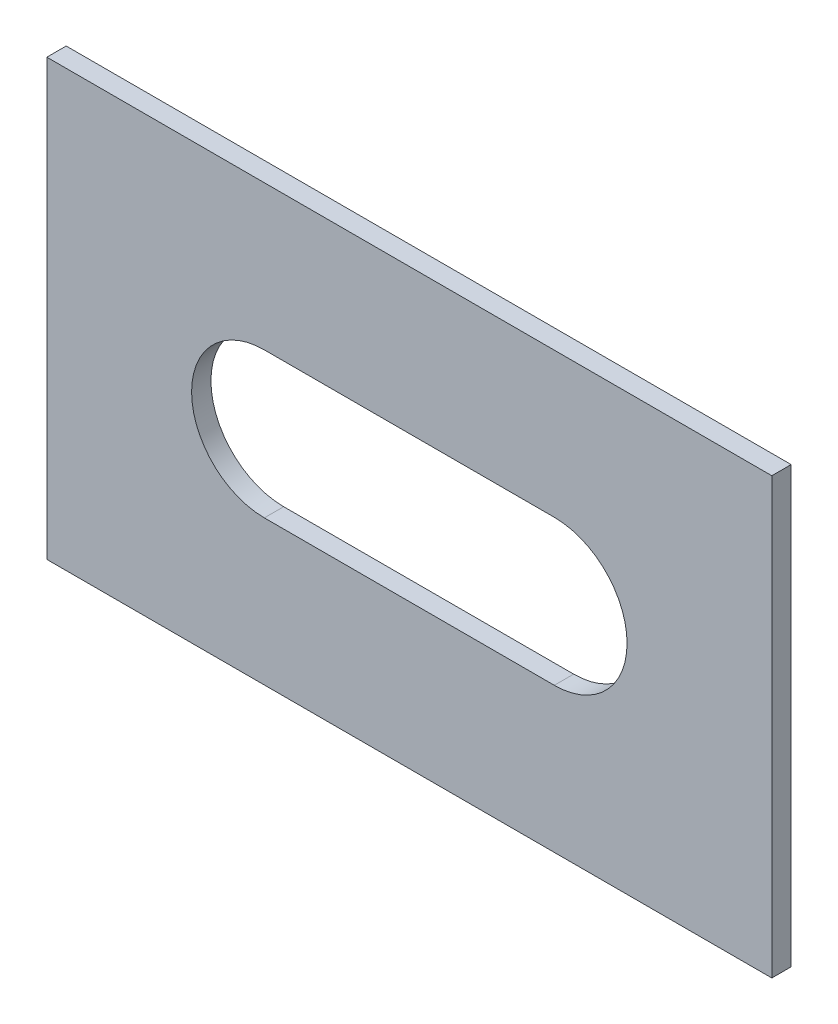
ISO-10303-21;
HEADER;
FILE_DESCRIPTION(('STEP AP214'),'2;1');
FILE_NAME('part.step','',(''),(''),'','','');
FILE_SCHEMA(('AUTOMOTIVE_DESIGN { 1 0 10303 214 1 1 1 1 }'));
ENDSEC;
DATA;
#1=APPLICATION_CONTEXT('core data for automotive mechanical design processes');
#2=APPLICATION_PROTOCOL_DEFINITION('international standard','automotive_design',2000,#1);
#3=PRODUCT_CONTEXT('',#1,'mechanical');
#4=PRODUCT('Part','Part','',(#3));
#5=PRODUCT_RELATED_PRODUCT_CATEGORY('part','',(#4));
#6=PRODUCT_DEFINITION_FORMATION('','',#4);
#7=PRODUCT_DEFINITION_CONTEXT('part definition',#1,'design');
#8=PRODUCT_DEFINITION('design','',#6,#7);
#9=PRODUCT_DEFINITION_SHAPE('','',#8);
#10=(LENGTH_UNIT() NAMED_UNIT(*) SI_UNIT(.MILLI.,.METRE.));
#11=(NAMED_UNIT(*) PLANE_ANGLE_UNIT() SI_UNIT($,.RADIAN.));
#12=(NAMED_UNIT(*) SI_UNIT($,.STERADIAN.) SOLID_ANGLE_UNIT());
#13=UNCERTAINTY_MEASURE_WITH_UNIT(LENGTH_MEASURE(1.E-05),#10,'distance_accuracy_value','');
#14=(GEOMETRIC_REPRESENTATION_CONTEXT(3) GLOBAL_UNCERTAINTY_ASSIGNED_CONTEXT((#13)) GLOBAL_UNIT_ASSIGNED_CONTEXT((#10,
#11,#12)) REPRESENTATION_CONTEXT('',''));
#15=CARTESIAN_POINT('',(0.,0.,0.));
#16=DIRECTION('',(0.,0.,1.));
#17=DIRECTION('',(1.,0.,0.));
#18=AXIS2_PLACEMENT_3D('',#15,#16,#17);
#19=CARTESIAN_POINT('',(0.,0.,4.));
#20=DIRECTION('',(0.,0.,-1.));
#21=DIRECTION('',(-1.,0.,0.));
#22=AXIS2_PLACEMENT_3D('',#19,#20,#21);
#23=PLANE('',#22);
#24=DIRECTION('',(0.,-1.,0.));
#25=VECTOR('',#24,1.);
#26=CARTESIAN_POINT('',(0.,0.,4.));
#27=LINE('',#26,#25);
#28=CARTESIAN_POINT('',(0.,90.,4.));
#29=VERTEX_POINT('',#28);
#30=CARTESIAN_POINT('',(0.,0.,4.));
#31=VERTEX_POINT('',#30);
#32=EDGE_CURVE('E146',#29,#31,#27,.T.);
#33=ORIENTED_EDGE('',*,*,#32,.T.);
#34=DIRECTION('',(1.,0.,0.));
#35=VECTOR('',#34,1.);
#36=CARTESIAN_POINT('',(0.,0.,4.));
#37=LINE('',#36,#35);
#38=CARTESIAN_POINT('',(150.,0.,4.));
#39=VERTEX_POINT('',#38);
#40=EDGE_CURVE('E149',#31,#39,#37,.T.);
#41=ORIENTED_EDGE('',*,*,#40,.T.);
#42=DIRECTION('',(0.,1.,0.));
#43=VECTOR('',#42,1.);
#44=CARTESIAN_POINT('',(150.,0.,4.));
#45=LINE('',#44,#43);
#46=CARTESIAN_POINT('',(150.,90.,4.));
#47=VERTEX_POINT('',#46);
#48=EDGE_CURVE('E152',#39,#47,#45,.T.);
#49=ORIENTED_EDGE('',*,*,#48,.T.);
#50=DIRECTION('',(-1.,0.,0.));
#51=VECTOR('',#50,1.);
#52=CARTESIAN_POINT('',(0.,90.,4.));
#53=LINE('',#52,#51);
#54=EDGE_CURVE('E154',#47,#29,#53,.T.);
#55=ORIENTED_EDGE('',*,*,#54,.T.);
#56=EDGE_LOOP('',(#33,#41,#49,#55));
#57=FACE_BOUND('',#56,.T.);
#58=CARTESIAN_POINT('',(105.,45.,4.));
#59=DIRECTION('',(0.,0.,1.));
#60=DIRECTION('',(1.,0.,0.));
#61=AXIS2_PLACEMENT_3D('',#58,#59,#60);
#62=CIRCLE('',#61,15.05);
#63=CARTESIAN_POINT('',(105.,29.95,4.));
#64=VERTEX_POINT('',#63);
#65=CARTESIAN_POINT('',(105.,60.05,4.));
#66=VERTEX_POINT('',#65);
#67=EDGE_CURVE('E110',#64,#66,#62,.T.);
#68=ORIENTED_EDGE('',*,*,#67,.F.);
#69=DIRECTION('',(1.,0.,0.));
#70=VECTOR('',#69,1.);
#71=CARTESIAN_POINT('',(45.,29.95,4.));
#72=LINE('',#71,#70);
#73=CARTESIAN_POINT('',(45.,29.95,4.));
#74=VERTEX_POINT('',#73);
#75=EDGE_CURVE('E132',#74,#64,#72,.T.);
#76=ORIENTED_EDGE('',*,*,#75,.F.);
#77=CARTESIAN_POINT('',(45.,45.,4.));
#78=DIRECTION('',(0.,0.,1.));
#79=DIRECTION('',(1.,0.,0.));
#80=AXIS2_PLACEMENT_3D('',#77,#78,#79);
#81=CIRCLE('',#80,15.05);
#82=CARTESIAN_POINT('',(45.,60.05,4.));
#83=VERTEX_POINT('',#82);
#84=EDGE_CURVE('E130',#83,#74,#81,.T.);
#85=ORIENTED_EDGE('',*,*,#84,.F.);
#86=DIRECTION('',(-1.,0.,0.));
#87=VECTOR('',#86,1.);
#88=CARTESIAN_POINT('',(45.,60.05,4.));
#89=LINE('',#88,#87);
#90=EDGE_CURVE('E118',#66,#83,#89,.T.);
#91=ORIENTED_EDGE('',*,*,#90,.F.);
#92=EDGE_LOOP('',(#68,#76,#85,#91));
#93=FACE_BOUND('',#92,.T.);
#94=ADVANCED_FACE('F45',(#57,#93),#23,.F.);
#95=CARTESIAN_POINT('',(0.,0.,0.));
#96=DIRECTION('',(0.,0.,-1.));
#97=DIRECTION('',(-1.,0.,0.));
#98=AXIS2_PLACEMENT_3D('',#95,#96,#97);
#99=PLANE('',#98);
#100=DIRECTION('',(0.,-1.,0.));
#101=VECTOR('',#100,1.);
#102=CARTESIAN_POINT('',(0.,0.,0.));
#103=LINE('',#102,#101);
#104=CARTESIAN_POINT('',(0.,90.,0.));
#105=VERTEX_POINT('',#104);
#106=CARTESIAN_POINT('',(0.,0.,0.));
#107=VERTEX_POINT('',#106);
#108=EDGE_CURVE('E126',#105,#107,#103,.T.);
#109=ORIENTED_EDGE('',*,*,#108,.F.);
#110=DIRECTION('',(-1.,0.,0.));
#111=VECTOR('',#110,1.);
#112=CARTESIAN_POINT('',(0.,90.,0.));
#113=LINE('',#112,#111);
#114=CARTESIAN_POINT('',(150.,90.,0.));
#115=VERTEX_POINT('',#114);
#116=EDGE_CURVE('E150',#115,#105,#113,.T.);
#117=ORIENTED_EDGE('',*,*,#116,.F.);
#118=DIRECTION('',(0.,1.,0.));
#119=VECTOR('',#118,1.);
#120=CARTESIAN_POINT('',(150.,0.,0.));
#121=LINE('',#120,#119);
#122=CARTESIAN_POINT('',(150.,0.,0.));
#123=VERTEX_POINT('',#122);
#124=EDGE_CURVE('E161',#123,#115,#121,.T.);
#125=ORIENTED_EDGE('',*,*,#124,.F.);
#126=DIRECTION('',(1.,0.,0.));
#127=VECTOR('',#126,1.);
#128=CARTESIAN_POINT('',(0.,0.,0.));
#129=LINE('',#128,#127);
#130=EDGE_CURVE('E159',#107,#123,#129,.T.);
#131=ORIENTED_EDGE('',*,*,#130,.F.);
#132=EDGE_LOOP('',(#109,#117,#125,#131));
#133=FACE_BOUND('',#132,.T.);
#134=DIRECTION('',(1.,0.,0.));
#135=VECTOR('',#134,1.);
#136=CARTESIAN_POINT('',(45.,29.95,0.));
#137=LINE('',#136,#135);
#138=CARTESIAN_POINT('',(45.,29.95,0.));
#139=VERTEX_POINT('',#138);
#140=CARTESIAN_POINT('',(105.,29.95,0.));
#141=VERTEX_POINT('',#140);
#142=EDGE_CURVE('E119',#139,#141,#137,.T.);
#143=ORIENTED_EDGE('',*,*,#142,.T.);
#144=CARTESIAN_POINT('',(105.,45.,0.));
#145=DIRECTION('',(0.,0.,1.));
#146=DIRECTION('',(1.,0.,0.));
#147=AXIS2_PLACEMENT_3D('',#144,#145,#146);
#148=CIRCLE('',#147,15.05);
#149=CARTESIAN_POINT('',(105.,60.05,0.));
#150=VERTEX_POINT('',#149);
#151=EDGE_CURVE('E68',#141,#150,#148,.T.);
#152=ORIENTED_EDGE('',*,*,#151,.T.);
#153=DIRECTION('',(-1.,0.,0.));
#154=VECTOR('',#153,1.);
#155=CARTESIAN_POINT('',(45.,60.05,0.));
#156=LINE('',#155,#154);
#157=CARTESIAN_POINT('',(45.,60.05,0.));
#158=VERTEX_POINT('',#157);
#159=EDGE_CURVE('E125',#150,#158,#156,.T.);
#160=ORIENTED_EDGE('',*,*,#159,.T.);
#161=CARTESIAN_POINT('',(45.,45.,0.));
#162=DIRECTION('',(0.,0.,1.));
#163=DIRECTION('',(1.,0.,0.));
#164=AXIS2_PLACEMENT_3D('',#161,#162,#163);
#165=CIRCLE('',#164,15.05);
#166=EDGE_CURVE('E138',#158,#139,#165,.T.);
#167=ORIENTED_EDGE('',*,*,#166,.T.);
#168=EDGE_LOOP('',(#143,#152,#160,#167));
#169=FACE_BOUND('',#168,.T.);
#170=ADVANCED_FACE('F179',(#133,#169),#99,.T.);
#171=CARTESIAN_POINT('',(0.,0.,4.));
#172=DIRECTION('',(1.,0.,0.));
#173=DIRECTION('',(0.,0.,-1.));
#174=AXIS2_PLACEMENT_3D('',#171,#172,#173);
#175=PLANE('',#174);
#176=ORIENTED_EDGE('',*,*,#108,.T.);
#177=DIRECTION('',(0.,0.,-1.));
#178=VECTOR('',#177,1.);
#179=CARTESIAN_POINT('',(0.,0.,4.));
#180=LINE('',#179,#178);
#181=EDGE_CURVE('E11',#31,#107,#180,.T.);
#182=ORIENTED_EDGE('',*,*,#181,.F.);
#183=ORIENTED_EDGE('',*,*,#32,.F.);
#184=DIRECTION('',(0.,0.,-1.));
#185=VECTOR('',#184,1.);
#186=CARTESIAN_POINT('',(0.,90.,4.));
#187=LINE('',#186,#185);
#188=EDGE_CURVE('E156',#29,#105,#187,.T.);
#189=ORIENTED_EDGE('',*,*,#188,.T.);
#190=EDGE_LOOP('',(#176,#182,#183,#189));
#191=FACE_BOUND('',#190,.T.);
#192=ADVANCED_FACE('F47',(#191),#175,.F.);
#193=CARTESIAN_POINT('',(0.,0.,4.));
#194=DIRECTION('',(0.,1.,0.));
#195=DIRECTION('',(0.,0.,1.));
#196=AXIS2_PLACEMENT_3D('',#193,#194,#195);
#197=PLANE('',#196);
#198=ORIENTED_EDGE('',*,*,#130,.T.);
#199=DIRECTION('',(0.,0.,-1.));
#200=VECTOR('',#199,1.);
#201=CARTESIAN_POINT('',(150.,0.,4.));
#202=LINE('',#201,#200);
#203=EDGE_CURVE('E53',#39,#123,#202,.T.);
#204=ORIENTED_EDGE('',*,*,#203,.F.);
#205=ORIENTED_EDGE('',*,*,#40,.F.);
#206=ORIENTED_EDGE('',*,*,#181,.T.);
#207=EDGE_LOOP('',(#198,#204,#205,#206));
#208=FACE_BOUND('',#207,.T.);
#209=ADVANCED_FACE('F189',(#208),#197,.F.);
#210=CARTESIAN_POINT('',(150.,0.,4.));
#211=DIRECTION('',(-1.,0.,0.));
#212=DIRECTION('',(0.,0.,1.));
#213=AXIS2_PLACEMENT_3D('',#210,#211,#212);
#214=PLANE('',#213);
#215=ORIENTED_EDGE('',*,*,#124,.T.);
#216=DIRECTION('',(0.,0.,-1.));
#217=VECTOR('',#216,1.);
#218=CARTESIAN_POINT('',(150.,90.,4.));
#219=LINE('',#218,#217);
#220=EDGE_CURVE('E166',#47,#115,#219,.T.);
#221=ORIENTED_EDGE('',*,*,#220,.F.);
#222=ORIENTED_EDGE('',*,*,#48,.F.);
#223=ORIENTED_EDGE('',*,*,#203,.T.);
#224=EDGE_LOOP('',(#215,#221,#222,#223));
#225=FACE_BOUND('',#224,.T.);
#226=ADVANCED_FACE('F173',(#225),#214,.F.);
#227=CARTESIAN_POINT('',(0.,90.,4.));
#228=DIRECTION('',(0.,-1.,0.));
#229=DIRECTION('',(0.,0.,-1.));
#230=AXIS2_PLACEMENT_3D('',#227,#228,#229);
#231=PLANE('',#230);
#232=ORIENTED_EDGE('',*,*,#116,.T.);
#233=ORIENTED_EDGE('',*,*,#188,.F.);
#234=ORIENTED_EDGE('',*,*,#54,.F.);
#235=ORIENTED_EDGE('',*,*,#220,.T.);
#236=EDGE_LOOP('',(#232,#233,#234,#235));
#237=FACE_BOUND('',#236,.T.);
#238=ADVANCED_FACE('F183',(#237),#231,.F.);
#239=CARTESIAN_POINT('',(105.,45.,4.));
#240=DIRECTION('',(0.,0.,-1.));
#241=DIRECTION('',(-1.,0.,0.));
#242=AXIS2_PLACEMENT_3D('',#239,#240,#241);
#243=CYLINDRICAL_SURFACE('',#242,15.05);
#244=ORIENTED_EDGE('',*,*,#151,.F.);
#245=DIRECTION('',(0.,0.,-1.));
#246=VECTOR('',#245,1.);
#247=CARTESIAN_POINT('',(105.,29.95,4.));
#248=LINE('',#247,#246);
#249=EDGE_CURVE('E114',#64,#141,#248,.T.);
#250=ORIENTED_EDGE('',*,*,#249,.F.);
#251=ORIENTED_EDGE('',*,*,#67,.T.);
#252=DIRECTION('',(0.,0.,-1.));
#253=VECTOR('',#252,1.);
#254=CARTESIAN_POINT('',(105.,60.05,4.));
#255=LINE('',#254,#253);
#256=EDGE_CURVE('E113',#66,#150,#255,.T.);
#257=ORIENTED_EDGE('',*,*,#256,.T.);
#258=EDGE_LOOP('',(#244,#250,#251,#257));
#259=FACE_BOUND('',#258,.T.);
#260=ADVANCED_FACE('F112',(#259),#243,.F.);
#261=CARTESIAN_POINT('',(45.,60.05,4.));
#262=DIRECTION('',(0.,-1.,0.));
#263=DIRECTION('',(1.,0.,0.));
#264=AXIS2_PLACEMENT_3D('',#261,#262,#263);
#265=PLANE('',#264);
#266=ORIENTED_EDGE('',*,*,#159,.F.);
#267=ORIENTED_EDGE('',*,*,#256,.F.);
#268=ORIENTED_EDGE('',*,*,#90,.T.);
#269=DIRECTION('',(0.,0.,-1.));
#270=VECTOR('',#269,1.);
#271=CARTESIAN_POINT('',(45.,60.05,4.));
#272=LINE('',#271,#270);
#273=EDGE_CURVE('E127',#83,#158,#272,.T.);
#274=ORIENTED_EDGE('',*,*,#273,.T.);
#275=EDGE_LOOP('',(#266,#267,#268,#274));
#276=FACE_BOUND('',#275,.T.);
#277=ADVANCED_FACE('F122',(#276),#265,.T.);
#278=CARTESIAN_POINT('',(45.,45.,4.));
#279=DIRECTION('',(0.,0.,-1.));
#280=DIRECTION('',(-1.,0.,0.));
#281=AXIS2_PLACEMENT_3D('',#278,#279,#280);
#282=CYLINDRICAL_SURFACE('',#281,15.05);
#283=ORIENTED_EDGE('',*,*,#166,.F.);
#284=ORIENTED_EDGE('',*,*,#273,.F.);
#285=ORIENTED_EDGE('',*,*,#84,.T.);
#286=DIRECTION('',(0.,0.,-1.));
#287=VECTOR('',#286,1.);
#288=CARTESIAN_POINT('',(45.,29.95,4.));
#289=LINE('',#288,#287);
#290=EDGE_CURVE('E60',#74,#139,#289,.T.);
#291=ORIENTED_EDGE('',*,*,#290,.T.);
#292=EDGE_LOOP('',(#283,#284,#285,#291));
#293=FACE_BOUND('',#292,.T.);
#294=ADVANCED_FACE('F212',(#293),#282,.F.);
#295=CARTESIAN_POINT('',(45.,29.95,4.));
#296=DIRECTION('',(0.,1.,0.));
#297=DIRECTION('',(-1.,0.,0.));
#298=AXIS2_PLACEMENT_3D('',#295,#296,#297);
#299=PLANE('',#298);
#300=ORIENTED_EDGE('',*,*,#142,.F.);
#301=ORIENTED_EDGE('',*,*,#290,.F.);
#302=ORIENTED_EDGE('',*,*,#75,.T.);
#303=ORIENTED_EDGE('',*,*,#249,.T.);
#304=EDGE_LOOP('',(#300,#301,#302,#303));
#305=FACE_BOUND('',#304,.T.);
#306=ADVANCED_FACE('F216',(#305),#299,.T.);
#307=CLOSED_SHELL('',(#94,#170,#192,#209,#226,#238,#260,#277,#294,#306));
#308=MANIFOLD_SOLID_BREP('B2',#307);
#309=ADVANCED_BREP_SHAPE_REPRESENTATION('',(#18,#308),#14);
#310=SHAPE_DEFINITION_REPRESENTATION(#9,#309);
ENDSEC;
END-ISO-10303-21;
